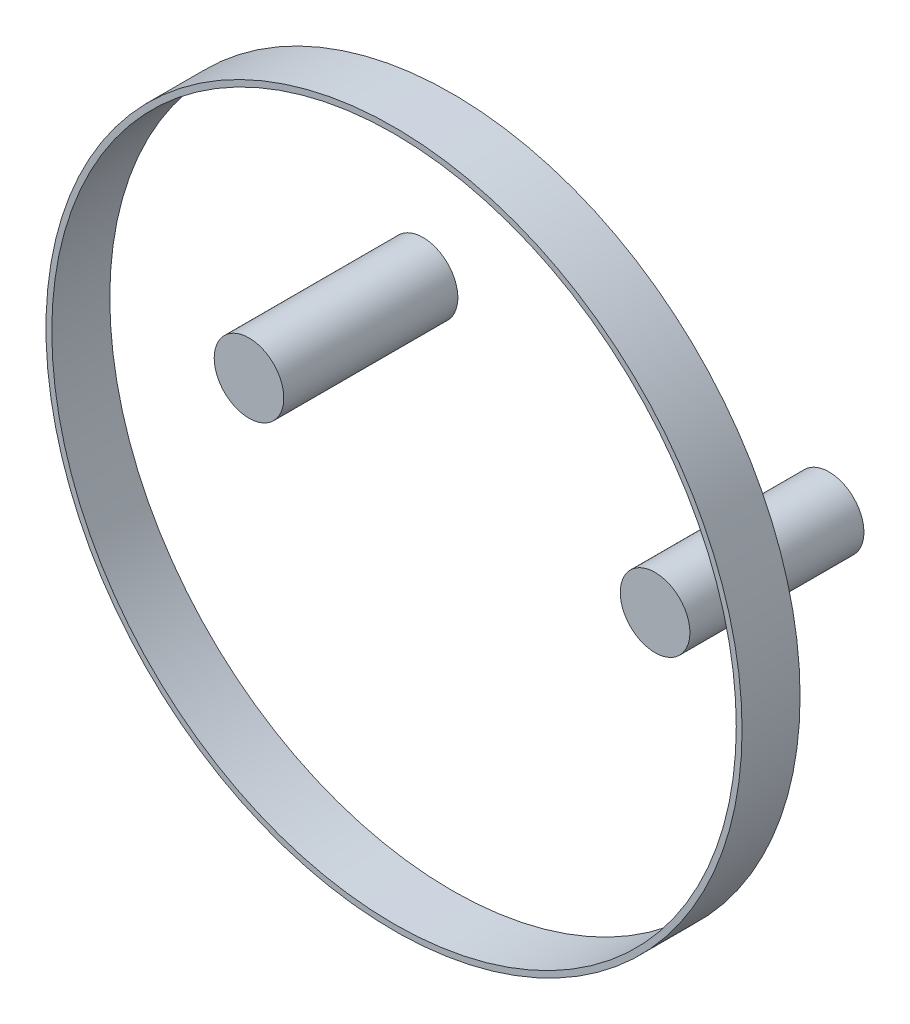
ISO-10303-21;
HEADER;
FILE_DESCRIPTION(('STEP AP214'),'2;1');
FILE_NAME('part.step','',(''),(''),'','','');
FILE_SCHEMA(('AUTOMOTIVE_DESIGN { 1 0 10303 214 1 1 1 1 }'));
ENDSEC;
DATA;
#1=APPLICATION_CONTEXT('core data for automotive mechanical design processes');
#2=APPLICATION_PROTOCOL_DEFINITION('international standard','automotive_design',2000,#1);
#3=PRODUCT_CONTEXT('',#1,'mechanical');
#4=PRODUCT('Part','Part','',(#3));
#5=PRODUCT_RELATED_PRODUCT_CATEGORY('part','',(#4));
#6=PRODUCT_DEFINITION_FORMATION('','',#4);
#7=PRODUCT_DEFINITION_CONTEXT('part definition',#1,'design');
#8=PRODUCT_DEFINITION('design','',#6,#7);
#9=PRODUCT_DEFINITION_SHAPE('','',#8);
#10=(LENGTH_UNIT() NAMED_UNIT(*) SI_UNIT(.MILLI.,.METRE.));
#11=(NAMED_UNIT(*) PLANE_ANGLE_UNIT() SI_UNIT($,.RADIAN.));
#12=(NAMED_UNIT(*) SI_UNIT($,.STERADIAN.) SOLID_ANGLE_UNIT());
#13=UNCERTAINTY_MEASURE_WITH_UNIT(LENGTH_MEASURE(1.E-05),#10,'distance_accuracy_value','');
#14=(GEOMETRIC_REPRESENTATION_CONTEXT(3) GLOBAL_UNCERTAINTY_ASSIGNED_CONTEXT((#13)) GLOBAL_UNIT_ASSIGNED_CONTEXT((#10,
#11,#12)) REPRESENTATION_CONTEXT('',''));
#15=CARTESIAN_POINT('',(0.,0.,0.));
#16=DIRECTION('',(0.,0.,1.));
#17=DIRECTION('',(1.,0.,0.));
#18=AXIS2_PLACEMENT_3D('',#15,#16,#17);
#19=CARTESIAN_POINT('',(-1.75,0.,0.));
#20=DIRECTION('',(0.,0.,1.));
#21=DIRECTION('',(1.,0.,0.));
#22=AXIS2_PLACEMENT_3D('',#19,#20,#21);
#23=PLANE('',#22);
#24=CARTESIAN_POINT('',(-1.75,0.,0.));
#25=DIRECTION('',(0.,0.,-1.));
#26=DIRECTION('',(-1.,0.,0.));
#27=AXIS2_PLACEMENT_3D('',#24,#25,#26);
#28=CIRCLE('',#27,0.3);
#29=CARTESIAN_POINT('',(-2.05,0.,0.));
#30=VERTEX_POINT('',#29);
#31=EDGE_CURVE('P0_E18',#30,#30,#28,.T.);
#32=ORIENTED_EDGE('',*,*,#31,.F.);
#33=EDGE_LOOP('',(#32));
#34=FACE_BOUND('',#33,.T.);
#35=ADVANCED_FACE('P0_F15',(#34),#23,.T.);
#36=CARTESIAN_POINT('',(-1.75,0.,-1.5));
#37=DIRECTION('',(0.,0.,1.));
#38=DIRECTION('',(1.,0.,0.));
#39=AXIS2_PLACEMENT_3D('',#36,#37,#38);
#40=PLANE('',#39);
#41=CARTESIAN_POINT('',(-1.75,0.,-1.5));
#42=DIRECTION('',(0.,0.,-1.));
#43=DIRECTION('',(-1.,0.,0.));
#44=AXIS2_PLACEMENT_3D('',#41,#42,#43);
#45=CIRCLE('',#44,0.3);
#46=CARTESIAN_POINT('',(-2.05,0.,-1.5));
#47=VERTEX_POINT('',#46);
#48=EDGE_CURVE('P0_E10',#47,#47,#45,.F.);
#49=ORIENTED_EDGE('',*,*,#48,.F.);
#50=EDGE_LOOP('',(#49));
#51=FACE_BOUND('',#50,.T.);
#52=ADVANCED_FACE('P0_F30',(#51),#40,.F.);
#53=CARTESIAN_POINT('',(-1.75,0.,0.));
#54=DIRECTION('',(0.,0.,-1.));
#55=DIRECTION('',(-1.,0.,0.));
#56=AXIS2_PLACEMENT_3D('',#53,#54,#55);
#57=CYLINDRICAL_SURFACE('',#56,0.3);
#58=ORIENTED_EDGE('',*,*,#48,.T.);
#59=EDGE_LOOP('',(#58));
#60=FACE_BOUND('',#59,.T.);
#61=ORIENTED_EDGE('',*,*,#31,.T.);
#62=EDGE_LOOP('',(#61));
#63=FACE_BOUND('',#62,.T.);
#64=ADVANCED_FACE('P0_F27',(#60,#63),#57,.T.);
#65=CLOSED_SHELL('',(#35,#52,#64));
#66=MANIFOLD_SOLID_BREP('P0_B1',#65);
#67=CARTESIAN_POINT('',(1.75,0.,0.));
#68=DIRECTION('',(0.,0.,1.));
#69=DIRECTION('',(1.,0.,0.));
#70=AXIS2_PLACEMENT_3D('',#67,#68,#69);
#71=PLANE('',#70);
#72=CARTESIAN_POINT('',(1.75,0.,0.));
#73=DIRECTION('',(0.,0.,-1.));
#74=DIRECTION('',(-1.,0.,0.));
#75=AXIS2_PLACEMENT_3D('',#72,#73,#74);
#76=CIRCLE('',#75,0.3);
#77=CARTESIAN_POINT('',(1.45,0.,0.));
#78=VERTEX_POINT('',#77);
#79=EDGE_CURVE('P1_E18',#78,#78,#76,.T.);
#80=ORIENTED_EDGE('',*,*,#79,.F.);
#81=EDGE_LOOP('',(#80));
#82=FACE_BOUND('',#81,.T.);
#83=ADVANCED_FACE('P1_F15',(#82),#71,.T.);
#84=CARTESIAN_POINT('',(1.75,0.,-1.5));
#85=DIRECTION('',(0.,0.,1.));
#86=DIRECTION('',(1.,0.,0.));
#87=AXIS2_PLACEMENT_3D('',#84,#85,#86);
#88=PLANE('',#87);
#89=CARTESIAN_POINT('',(1.75,0.,-1.5));
#90=DIRECTION('',(0.,0.,-1.));
#91=DIRECTION('',(-1.,0.,0.));
#92=AXIS2_PLACEMENT_3D('',#89,#90,#91);
#93=CIRCLE('',#92,0.3);
#94=CARTESIAN_POINT('',(1.45,0.,-1.5));
#95=VERTEX_POINT('',#94);
#96=EDGE_CURVE('P1_E10',#95,#95,#93,.F.);
#97=ORIENTED_EDGE('',*,*,#96,.F.);
#98=EDGE_LOOP('',(#97));
#99=FACE_BOUND('',#98,.T.);
#100=ADVANCED_FACE('P1_F30',(#99),#88,.F.);
#101=CARTESIAN_POINT('',(1.75,0.,0.));
#102=DIRECTION('',(0.,0.,-1.));
#103=DIRECTION('',(-1.,0.,0.));
#104=AXIS2_PLACEMENT_3D('',#101,#102,#103);
#105=CYLINDRICAL_SURFACE('',#104,0.3);
#106=ORIENTED_EDGE('',*,*,#96,.T.);
#107=EDGE_LOOP('',(#106));
#108=FACE_BOUND('',#107,.T.);
#109=ORIENTED_EDGE('',*,*,#79,.T.);
#110=EDGE_LOOP('',(#109));
#111=FACE_BOUND('',#110,.T.);
#112=ADVANCED_FACE('P1_F27',(#108,#111),#105,.T.);
#113=CLOSED_SHELL('',(#83,#100,#112));
#114=MANIFOLD_SOLID_BREP('P1_B1',#113);
#115=CARTESIAN_POINT('',(0.,0.,0.25));
#116=DIRECTION('',(0.,0.,1.));
#117=DIRECTION('',(1.,0.,0.));
#118=AXIS2_PLACEMENT_3D('',#115,#116,#117);
#119=CYLINDRICAL_SURFACE('',#118,2.95);
#120=CARTESIAN_POINT('',(0.,0.,0.));
#121=DIRECTION('',(0.,0.,1.));
#122=DIRECTION('',(1.,0.,0.));
#123=AXIS2_PLACEMENT_3D('',#120,#121,#122);
#124=CIRCLE('',#123,2.95);
#125=CARTESIAN_POINT('',(2.95,0.,0.));
#126=VERTEX_POINT('',#125);
#127=EDGE_CURVE('P2_E18',#126,#126,#124,.T.);
#128=ORIENTED_EDGE('',*,*,#127,.F.);
#129=EDGE_LOOP('',(#128));
#130=FACE_BOUND('',#129,.T.);
#131=CARTESIAN_POINT('',(0.,0.,0.5));
#132=DIRECTION('',(0.,0.,1.));
#133=DIRECTION('',(1.,0.,0.));
#134=AXIS2_PLACEMENT_3D('',#131,#132,#133);
#135=CIRCLE('',#134,2.95);
#136=CARTESIAN_POINT('',(2.95,0.,0.5));
#137=VERTEX_POINT('',#136);
#138=EDGE_CURVE('P2_E27',#137,#137,#135,.F.);
#139=ORIENTED_EDGE('',*,*,#138,.F.);
#140=EDGE_LOOP('',(#139));
#141=FACE_BOUND('',#140,.T.);
#142=ADVANCED_FACE('P2_F15',(#130,#141),#119,.F.);
#143=CARTESIAN_POINT('',(3.,0.,0.));
#144=DIRECTION('',(0.,0.,-1.));
#145=DIRECTION('',(-1.,0.,0.));
#146=AXIS2_PLACEMENT_3D('',#143,#144,#145);
#147=PLANE('',#146);
#148=CARTESIAN_POINT('',(0.,0.,0.));
#149=DIRECTION('',(0.,0.,1.));
#150=DIRECTION('',(1.,0.,0.));
#151=AXIS2_PLACEMENT_3D('',#148,#149,#150);
#152=CIRCLE('',#151,3.);
#153=CARTESIAN_POINT('',(3.,0.,0.));
#154=VERTEX_POINT('',#153);
#155=EDGE_CURVE('P2_E22',#154,#154,#152,.T.);
#156=ORIENTED_EDGE('',*,*,#155,.F.);
#157=EDGE_LOOP('',(#156));
#158=FACE_BOUND('',#157,.T.);
#159=ORIENTED_EDGE('',*,*,#127,.T.);
#160=EDGE_LOOP('',(#159));
#161=FACE_BOUND('',#160,.T.);
#162=ADVANCED_FACE('P2_F35',(#158,#161),#147,.T.);
#163=CARTESIAN_POINT('',(2.95,0.,0.5));
#164=DIRECTION('',(0.,0.,1.));
#165=DIRECTION('',(1.,0.,0.));
#166=AXIS2_PLACEMENT_3D('',#163,#164,#165);
#167=PLANE('',#166);
#168=CARTESIAN_POINT('',(0.,0.,0.5));
#169=DIRECTION('',(0.,0.,1.));
#170=DIRECTION('',(1.,0.,0.));
#171=AXIS2_PLACEMENT_3D('',#168,#169,#170);
#172=CIRCLE('',#171,3.);
#173=CARTESIAN_POINT('',(3.,0.,0.5));
#174=VERTEX_POINT('',#173);
#175=EDGE_CURVE('P2_E10',#174,#174,#172,.F.);
#176=ORIENTED_EDGE('',*,*,#175,.F.);
#177=EDGE_LOOP('',(#176));
#178=FACE_BOUND('',#177,.T.);
#179=ORIENTED_EDGE('',*,*,#138,.T.);
#180=EDGE_LOOP('',(#179));
#181=FACE_BOUND('',#180,.T.);
#182=ADVANCED_FACE('P2_F43',(#178,#181),#167,.T.);
#183=CARTESIAN_POINT('',(0.,0.,0.25));
#184=DIRECTION('',(0.,0.,1.));
#185=DIRECTION('',(1.,0.,0.));
#186=AXIS2_PLACEMENT_3D('',#183,#184,#185);
#187=CYLINDRICAL_SURFACE('',#186,3.);
#188=ORIENTED_EDGE('',*,*,#155,.T.);
#189=EDGE_LOOP('',(#188));
#190=FACE_BOUND('',#189,.T.);
#191=ORIENTED_EDGE('',*,*,#175,.T.);
#192=EDGE_LOOP('',(#191));
#193=FACE_BOUND('',#192,.T.);
#194=ADVANCED_FACE('P2_F45',(#190,#193),#187,.T.);
#195=CLOSED_SHELL('',(#142,#162,#182,#194));
#196=MANIFOLD_SOLID_BREP('P2_B1',#195);
#197=ADVANCED_BREP_SHAPE_REPRESENTATION('',(#18,#66,#114,#196),#14);
#198=SHAPE_DEFINITION_REPRESENTATION(#9,#197);
ENDSEC;
END-ISO-10303-21;
